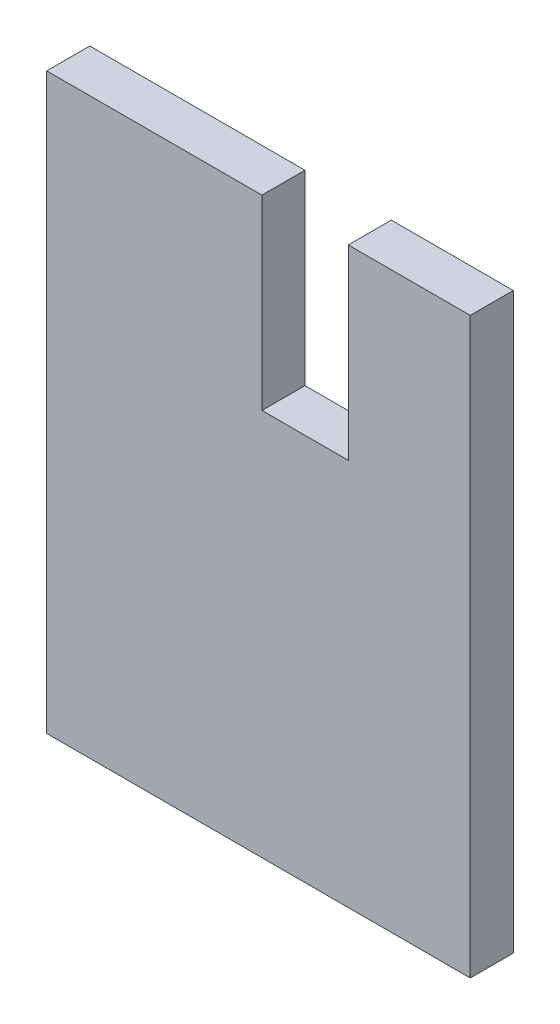
ISO-10303-21;
HEADER;
FILE_DESCRIPTION(('STEP AP214'),'2;1');
FILE_NAME('part.step','',(''),(''),'','','');
FILE_SCHEMA(('AUTOMOTIVE_DESIGN { 1 0 10303 214 1 1 1 1 }'));
ENDSEC;
DATA;
#1=APPLICATION_CONTEXT('core data for automotive mechanical design processes');
#2=APPLICATION_PROTOCOL_DEFINITION('international standard','automotive_design',2000,#1);
#3=PRODUCT_CONTEXT('',#1,'mechanical');
#4=PRODUCT('Part','Part','',(#3));
#5=PRODUCT_RELATED_PRODUCT_CATEGORY('part','',(#4));
#6=PRODUCT_DEFINITION_FORMATION('','',#4);
#7=PRODUCT_DEFINITION_CONTEXT('part definition',#1,'design');
#8=PRODUCT_DEFINITION('design','',#6,#7);
#9=PRODUCT_DEFINITION_SHAPE('','',#8);
#10=(LENGTH_UNIT() NAMED_UNIT(*) SI_UNIT(.MILLI.,.METRE.));
#11=(NAMED_UNIT(*) PLANE_ANGLE_UNIT() SI_UNIT($,.RADIAN.));
#12=(NAMED_UNIT(*) SI_UNIT($,.STERADIAN.) SOLID_ANGLE_UNIT());
#13=UNCERTAINTY_MEASURE_WITH_UNIT(LENGTH_MEASURE(1.E-05),#10,'distance_accuracy_value','');
#14=(GEOMETRIC_REPRESENTATION_CONTEXT(3) GLOBAL_UNCERTAINTY_ASSIGNED_CONTEXT((#13)) GLOBAL_UNIT_ASSIGNED_CONTEXT((#10,
#11,#12)) REPRESENTATION_CONTEXT('',''));
#15=CARTESIAN_POINT('',(0.,0.,0.));
#16=DIRECTION('',(0.,0.,1.));
#17=DIRECTION('',(1.,0.,0.));
#18=AXIS2_PLACEMENT_3D('',#15,#16,#17);
#19=CARTESIAN_POINT('',(59.04,0.,6.));
#20=DIRECTION('',(0.,1.,0.));
#21=DIRECTION('',(-1.,0.,0.));
#22=AXIS2_PLACEMENT_3D('',#19,#20,#21);
#23=PLANE('',#22);
#24=DIRECTION('',(1.,0.,0.));
#25=VECTOR('',#24,1.);
#26=CARTESIAN_POINT('',(59.04,0.,0.));
#27=LINE('',#26,#25);
#28=CARTESIAN_POINT('',(0.,0.,0.));
#29=VERTEX_POINT('',#28);
#30=CARTESIAN_POINT('',(59.04,0.,0.));
#31=VERTEX_POINT('',#30);
#32=EDGE_CURVE('E131',#29,#31,#27,.T.);
#33=ORIENTED_EDGE('',*,*,#32,.T.);
#34=DIRECTION('',(0.,0.,-1.));
#35=VECTOR('',#34,1.);
#36=CARTESIAN_POINT('',(59.04,0.,6.));
#37=LINE('',#36,#35);
#38=CARTESIAN_POINT('',(59.04,0.,6.));
#39=VERTEX_POINT('',#38);
#40=EDGE_CURVE('E11',#39,#31,#37,.T.);
#41=ORIENTED_EDGE('',*,*,#40,.F.);
#42=DIRECTION('',(1.,0.,0.));
#43=VECTOR('',#42,1.);
#44=CARTESIAN_POINT('',(59.04,0.,6.));
#45=LINE('',#44,#43);
#46=CARTESIAN_POINT('',(0.,0.,6.));
#47=VERTEX_POINT('',#46);
#48=EDGE_CURVE('E145',#47,#39,#45,.T.);
#49=ORIENTED_EDGE('',*,*,#48,.F.);
#50=DIRECTION('',(0.,0.,-1.));
#51=VECTOR('',#50,1.);
#52=CARTESIAN_POINT('',(0.,0.,6.));
#53=LINE('',#52,#51);
#54=EDGE_CURVE('E127',#47,#29,#53,.T.);
#55=ORIENTED_EDGE('',*,*,#54,.T.);
#56=EDGE_LOOP('',(#33,#41,#49,#55));
#57=FACE_BOUND('',#56,.T.);
#58=ADVANCED_FACE('F35',(#57),#23,.F.);
#59=CARTESIAN_POINT('',(59.04,80.,6.));
#60=DIRECTION('',(-1.,0.,0.));
#61=DIRECTION('',(0.,-1.,0.));
#62=AXIS2_PLACEMENT_3D('',#59,#60,#61);
#63=PLANE('',#62);
#64=DIRECTION('',(0.,1.,0.));
#65=VECTOR('',#64,1.);
#66=CARTESIAN_POINT('',(59.04,80.,0.));
#67=LINE('',#66,#65);
#68=CARTESIAN_POINT('',(59.04,80.,0.));
#69=VERTEX_POINT('',#68);
#70=EDGE_CURVE('E134',#31,#69,#67,.T.);
#71=ORIENTED_EDGE('',*,*,#70,.T.);
#72=DIRECTION('',(0.,0.,-1.));
#73=VECTOR('',#72,1.);
#74=CARTESIAN_POINT('',(59.04,80.,6.));
#75=LINE('',#74,#73);
#76=CARTESIAN_POINT('',(59.04,80.,6.));
#77=VERTEX_POINT('',#76);
#78=EDGE_CURVE('E43',#77,#69,#75,.T.);
#79=ORIENTED_EDGE('',*,*,#78,.F.);
#80=DIRECTION('',(0.,1.,0.));
#81=VECTOR('',#80,1.);
#82=CARTESIAN_POINT('',(59.04,80.,6.));
#83=LINE('',#82,#81);
#84=EDGE_CURVE('E94',#39,#77,#83,.T.);
#85=ORIENTED_EDGE('',*,*,#84,.F.);
#86=ORIENTED_EDGE('',*,*,#40,.T.);
#87=EDGE_LOOP('',(#71,#79,#85,#86));
#88=FACE_BOUND('',#87,.T.);
#89=ADVANCED_FACE('F180',(#88),#63,.F.);
#90=CARTESIAN_POINT('',(42.04,80.,6.));
#91=DIRECTION('',(0.,-1.,0.));
#92=DIRECTION('',(0.,0.,-1.));
#93=AXIS2_PLACEMENT_3D('',#90,#91,#92);
#94=PLANE('',#93);
#95=DIRECTION('',(-1.,0.,0.));
#96=VECTOR('',#95,1.);
#97=CARTESIAN_POINT('',(42.04,80.,0.));
#98=LINE('',#97,#96);
#99=CARTESIAN_POINT('',(42.04,80.,0.));
#100=VERTEX_POINT('',#99);
#101=EDGE_CURVE('E136',#69,#100,#98,.T.);
#102=ORIENTED_EDGE('',*,*,#101,.T.);
#103=DIRECTION('',(0.,0.,-1.));
#104=VECTOR('',#103,1.);
#105=CARTESIAN_POINT('',(42.04,80.,6.));
#106=LINE('',#105,#104);
#107=CARTESIAN_POINT('',(42.04,80.,6.));
#108=VERTEX_POINT('',#107);
#109=EDGE_CURVE('E152',#108,#100,#106,.T.);
#110=ORIENTED_EDGE('',*,*,#109,.F.);
#111=DIRECTION('',(-1.,0.,0.));
#112=VECTOR('',#111,1.);
#113=CARTESIAN_POINT('',(42.04,80.,6.));
#114=LINE('',#113,#112);
#115=EDGE_CURVE('E160',#77,#108,#114,.T.);
#116=ORIENTED_EDGE('',*,*,#115,.F.);
#117=ORIENTED_EDGE('',*,*,#78,.T.);
#118=EDGE_LOOP('',(#102,#110,#116,#117));
#119=FACE_BOUND('',#118,.T.);
#120=ADVANCED_FACE('F158',(#119),#94,.F.);
#121=CARTESIAN_POINT('',(42.04,54.,6.));
#122=DIRECTION('',(1.,0.,0.));
#123=DIRECTION('',(0.,0.,-1.));
#124=AXIS2_PLACEMENT_3D('',#121,#122,#123);
#125=PLANE('',#124);
#126=DIRECTION('',(0.,-1.,0.));
#127=VECTOR('',#126,1.);
#128=CARTESIAN_POINT('',(42.04,54.,0.));
#129=LINE('',#128,#127);
#130=CARTESIAN_POINT('',(42.04,54.,0.));
#131=VERTEX_POINT('',#130);
#132=EDGE_CURVE('E138',#100,#131,#129,.T.);
#133=ORIENTED_EDGE('',*,*,#132,.T.);
#134=DIRECTION('',(0.,0.,-1.));
#135=VECTOR('',#134,1.);
#136=CARTESIAN_POINT('',(42.04,54.,6.));
#137=LINE('',#136,#135);
#138=CARTESIAN_POINT('',(42.04,54.,6.));
#139=VERTEX_POINT('',#138);
#140=EDGE_CURVE('E149',#139,#131,#137,.T.);
#141=ORIENTED_EDGE('',*,*,#140,.F.);
#142=DIRECTION('',(0.,-1.,0.));
#143=VECTOR('',#142,1.);
#144=CARTESIAN_POINT('',(42.04,54.,6.));
#145=LINE('',#144,#143);
#146=EDGE_CURVE('E172',#108,#139,#145,.T.);
#147=ORIENTED_EDGE('',*,*,#146,.F.);
#148=ORIENTED_EDGE('',*,*,#109,.T.);
#149=EDGE_LOOP('',(#133,#141,#147,#148));
#150=FACE_BOUND('',#149,.T.);
#151=ADVANCED_FACE('F168',(#150),#125,.F.);
#152=CARTESIAN_POINT('',(30.,54.,6.));
#153=DIRECTION('',(0.,-1.,0.));
#154=DIRECTION('',(0.,0.,-1.));
#155=AXIS2_PLACEMENT_3D('',#152,#153,#154);
#156=PLANE('',#155);
#157=DIRECTION('',(-1.,0.,0.));
#158=VECTOR('',#157,1.);
#159=CARTESIAN_POINT('',(30.,54.,0.));
#160=LINE('',#159,#158);
#161=CARTESIAN_POINT('',(30.,54.,0.));
#162=VERTEX_POINT('',#161);
#163=EDGE_CURVE('E140',#131,#162,#160,.T.);
#164=ORIENTED_EDGE('',*,*,#163,.T.);
#165=DIRECTION('',(0.,0.,-1.));
#166=VECTOR('',#165,1.);
#167=CARTESIAN_POINT('',(30.,54.,6.));
#168=LINE('',#167,#166);
#169=CARTESIAN_POINT('',(30.,54.,6.));
#170=VERTEX_POINT('',#169);
#171=EDGE_CURVE('E122',#170,#162,#168,.T.);
#172=ORIENTED_EDGE('',*,*,#171,.F.);
#173=DIRECTION('',(-1.,0.,0.));
#174=VECTOR('',#173,1.);
#175=CARTESIAN_POINT('',(30.,54.,6.));
#176=LINE('',#175,#174);
#177=EDGE_CURVE('E113',#139,#170,#176,.T.);
#178=ORIENTED_EDGE('',*,*,#177,.F.);
#179=ORIENTED_EDGE('',*,*,#140,.T.);
#180=EDGE_LOOP('',(#164,#172,#178,#179));
#181=FACE_BOUND('',#180,.T.);
#182=ADVANCED_FACE('F171',(#181),#156,.F.);
#183=CARTESIAN_POINT('',(30.,80.,6.));
#184=DIRECTION('',(-1.,0.,0.));
#185=DIRECTION('',(0.,-1.,0.));
#186=AXIS2_PLACEMENT_3D('',#183,#184,#185);
#187=PLANE('',#186);
#188=DIRECTION('',(0.,1.,0.));
#189=VECTOR('',#188,1.);
#190=CARTESIAN_POINT('',(30.,80.,0.));
#191=LINE('',#190,#189);
#192=CARTESIAN_POINT('',(30.,80.,0.));
#193=VERTEX_POINT('',#192);
#194=EDGE_CURVE('E121',#162,#193,#191,.T.);
#195=ORIENTED_EDGE('',*,*,#194,.T.);
#196=DIRECTION('',(0.,0.,-1.));
#197=VECTOR('',#196,1.);
#198=CARTESIAN_POINT('',(30.,80.,6.));
#199=LINE('',#198,#197);
#200=CARTESIAN_POINT('',(30.,80.,6.));
#201=VERTEX_POINT('',#200);
#202=EDGE_CURVE('E118',#201,#193,#199,.T.);
#203=ORIENTED_EDGE('',*,*,#202,.F.);
#204=DIRECTION('',(0.,1.,0.));
#205=VECTOR('',#204,1.);
#206=CARTESIAN_POINT('',(30.,80.,6.));
#207=LINE('',#206,#205);
#208=EDGE_CURVE('E107',#170,#201,#207,.T.);
#209=ORIENTED_EDGE('',*,*,#208,.F.);
#210=ORIENTED_EDGE('',*,*,#171,.T.);
#211=EDGE_LOOP('',(#195,#203,#209,#210));
#212=FACE_BOUND('',#211,.T.);
#213=ADVANCED_FACE('F119',(#212),#187,.F.);
#214=CARTESIAN_POINT('',(0.,80.,6.));
#215=DIRECTION('',(0.,-1.,0.));
#216=DIRECTION('',(0.,0.,-1.));
#217=AXIS2_PLACEMENT_3D('',#214,#215,#216);
#218=PLANE('',#217);
#219=DIRECTION('',(-1.,0.,0.));
#220=VECTOR('',#219,1.);
#221=CARTESIAN_POINT('',(0.,80.,0.));
#222=LINE('',#221,#220);
#223=CARTESIAN_POINT('',(0.,80.,0.));
#224=VERTEX_POINT('',#223);
#225=EDGE_CURVE('E80',#193,#224,#222,.T.);
#226=ORIENTED_EDGE('',*,*,#225,.T.);
#227=DIRECTION('',(0.,0.,-1.));
#228=VECTOR('',#227,1.);
#229=CARTESIAN_POINT('',(0.,80.,6.));
#230=LINE('',#229,#228);
#231=CARTESIAN_POINT('',(0.,80.,6.));
#232=VERTEX_POINT('',#231);
#233=EDGE_CURVE('E123',#232,#224,#230,.T.);
#234=ORIENTED_EDGE('',*,*,#233,.F.);
#235=DIRECTION('',(-1.,0.,0.));
#236=VECTOR('',#235,1.);
#237=CARTESIAN_POINT('',(0.,80.,6.));
#238=LINE('',#237,#236);
#239=EDGE_CURVE('E111',#201,#232,#238,.T.);
#240=ORIENTED_EDGE('',*,*,#239,.F.);
#241=ORIENTED_EDGE('',*,*,#202,.T.);
#242=EDGE_LOOP('',(#226,#234,#240,#241));
#243=FACE_BOUND('',#242,.T.);
#244=ADVANCED_FACE('F125',(#243),#218,.F.);
#245=CARTESIAN_POINT('',(0.,0.,6.));
#246=DIRECTION('',(1.,0.,0.));
#247=DIRECTION('',(0.,0.,-1.));
#248=AXIS2_PLACEMENT_3D('',#245,#246,#247);
#249=PLANE('',#248);
#250=DIRECTION('',(0.,-1.,0.));
#251=VECTOR('',#250,1.);
#252=CARTESIAN_POINT('',(0.,0.,0.));
#253=LINE('',#252,#251);
#254=EDGE_CURVE('E86',#224,#29,#253,.T.);
#255=ORIENTED_EDGE('',*,*,#254,.T.);
#256=ORIENTED_EDGE('',*,*,#54,.F.);
#257=DIRECTION('',(0.,-1.,0.));
#258=VECTOR('',#257,1.);
#259=CARTESIAN_POINT('',(0.,0.,6.));
#260=LINE('',#259,#258);
#261=EDGE_CURVE('E51',#232,#47,#260,.T.);
#262=ORIENTED_EDGE('',*,*,#261,.F.);
#263=ORIENTED_EDGE('',*,*,#233,.T.);
#264=EDGE_LOOP('',(#255,#256,#262,#263));
#265=FACE_BOUND('',#264,.T.);
#266=ADVANCED_FACE('F196',(#265),#249,.F.);
#267=CARTESIAN_POINT('',(0.,0.,6.));
#268=DIRECTION('',(0.,0.,-1.));
#269=DIRECTION('',(-1.,0.,0.));
#270=AXIS2_PLACEMENT_3D('',#267,#268,#269);
#271=PLANE('',#270);
#272=ORIENTED_EDGE('',*,*,#48,.T.);
#273=ORIENTED_EDGE('',*,*,#84,.T.);
#274=ORIENTED_EDGE('',*,*,#115,.T.);
#275=ORIENTED_EDGE('',*,*,#146,.T.);
#276=ORIENTED_EDGE('',*,*,#177,.T.);
#277=ORIENTED_EDGE('',*,*,#208,.T.);
#278=ORIENTED_EDGE('',*,*,#239,.T.);
#279=ORIENTED_EDGE('',*,*,#261,.T.);
#280=EDGE_LOOP('',(#272,#273,#274,#275,#276,#277,#278,#279));
#281=FACE_BOUND('',#280,.T.);
#282=ADVANCED_FACE('F109',(#281),#271,.F.);
#283=CARTESIAN_POINT('',(0.,0.,0.));
#284=DIRECTION('',(0.,0.,-1.));
#285=DIRECTION('',(-1.,0.,0.));
#286=AXIS2_PLACEMENT_3D('',#283,#284,#285);
#287=PLANE('',#286);
#288=ORIENTED_EDGE('',*,*,#32,.F.);
#289=ORIENTED_EDGE('',*,*,#254,.F.);
#290=ORIENTED_EDGE('',*,*,#225,.F.);
#291=ORIENTED_EDGE('',*,*,#194,.F.);
#292=ORIENTED_EDGE('',*,*,#163,.F.);
#293=ORIENTED_EDGE('',*,*,#132,.F.);
#294=ORIENTED_EDGE('',*,*,#101,.F.);
#295=ORIENTED_EDGE('',*,*,#70,.F.);
#296=EDGE_LOOP('',(#288,#289,#290,#291,#292,#293,#294,#295));
#297=FACE_BOUND('',#296,.T.);
#298=ADVANCED_FACE('F164',(#297),#287,.T.);
#299=CLOSED_SHELL('',(#58,#89,#120,#151,#182,#213,#244,#266,#282,#298));
#300=MANIFOLD_SOLID_BREP('B2',#299);
#301=ADVANCED_BREP_SHAPE_REPRESENTATION('',(#18,#300),#14);
#302=SHAPE_DEFINITION_REPRESENTATION(#9,#301);
ENDSEC;
END-ISO-10303-21;
